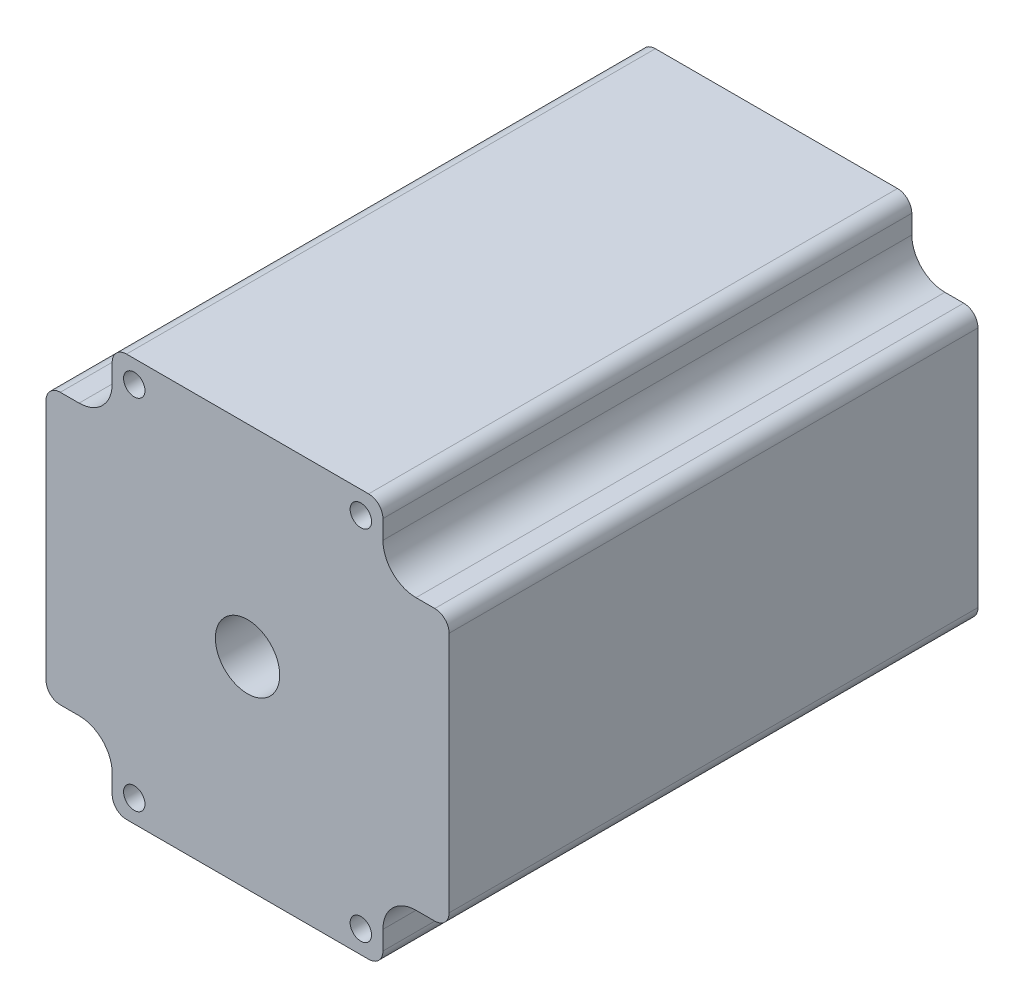
ISO-10303-21;
HEADER;
FILE_DESCRIPTION(('STEP AP214'),'2;1');
FILE_NAME('part.step','',(''),(''),'','','');
FILE_SCHEMA(('AUTOMOTIVE_DESIGN { 1 0 10303 214 1 1 1 1 }'));
ENDSEC;
DATA;
#1=APPLICATION_CONTEXT('core data for automotive mechanical design processes');
#2=APPLICATION_PROTOCOL_DEFINITION('international standard','automotive_design',2000,#1);
#3=PRODUCT_CONTEXT('',#1,'mechanical');
#4=PRODUCT('Part','Part','',(#3));
#5=PRODUCT_RELATED_PRODUCT_CATEGORY('part','',(#4));
#6=PRODUCT_DEFINITION_FORMATION('','',#4);
#7=PRODUCT_DEFINITION_CONTEXT('part definition',#1,'design');
#8=PRODUCT_DEFINITION('design','',#6,#7);
#9=PRODUCT_DEFINITION_SHAPE('','',#8);
#10=(LENGTH_UNIT() NAMED_UNIT(*) SI_UNIT(.MILLI.,.METRE.));
#11=(NAMED_UNIT(*) PLANE_ANGLE_UNIT() SI_UNIT($,.RADIAN.));
#12=(NAMED_UNIT(*) SI_UNIT($,.STERADIAN.) SOLID_ANGLE_UNIT());
#13=UNCERTAINTY_MEASURE_WITH_UNIT(LENGTH_MEASURE(1.E-05),#10,'distance_accuracy_value','');
#14=(GEOMETRIC_REPRESENTATION_CONTEXT(3) GLOBAL_UNCERTAINTY_ASSIGNED_CONTEXT((#13)) GLOBAL_UNIT_ASSIGNED_CONTEXT((#10,
#11,#12)) REPRESENTATION_CONTEXT('',''));
#15=CARTESIAN_POINT('',(0.,0.,0.));
#16=DIRECTION('',(0.,0.,1.));
#17=DIRECTION('',(1.,0.,0.));
#18=AXIS2_PLACEMENT_3D('',#15,#16,#17);
#19=CARTESIAN_POINT('',(26.2,16.94,-85.));
#20=DIRECTION('',(0.,0.,1.));
#21=DIRECTION('',(1.,0.,0.));
#22=AXIS2_PLACEMENT_3D('',#19,#20,#21);
#23=CYLINDRICAL_SURFACE('',#22,2.);
#24=CARTESIAN_POINT('',(26.2,16.94,-11.));
#25=DIRECTION('',(0.,0.,-1.));
#26=DIRECTION('',(-1.,0.,0.));
#27=AXIS2_PLACEMENT_3D('',#24,#25,#26);
#28=CIRCLE('',#27,2.);
#29=CARTESIAN_POINT('',(26.2,18.94,-11.));
#30=VERTEX_POINT('',#29);
#31=CARTESIAN_POINT('',(28.2,16.94,-11.));
#32=VERTEX_POINT('',#31);
#33=EDGE_CURVE('E231',#30,#32,#28,.T.);
#34=ORIENTED_EDGE('',*,*,#33,.T.);
#35=DIRECTION('',(0.,0.,1.));
#36=VECTOR('',#35,1.);
#37=CARTESIAN_POINT('',(28.2,16.94,-85.));
#38=LINE('',#37,#36);
#39=CARTESIAN_POINT('',(28.2,16.94,-85.));
#40=VERTEX_POINT('',#39);
#41=EDGE_CURVE('E11',#40,#32,#38,.T.);
#42=ORIENTED_EDGE('',*,*,#41,.F.);
#43=CARTESIAN_POINT('',(26.2,16.94,-85.));
#44=DIRECTION('',(0.,0.,-1.));
#45=DIRECTION('',(-1.,0.,0.));
#46=AXIS2_PLACEMENT_3D('',#43,#44,#45);
#47=CIRCLE('',#46,2.);
#48=CARTESIAN_POINT('',(26.2,18.94,-85.));
#49=VERTEX_POINT('',#48);
#50=EDGE_CURVE('E278',#49,#40,#47,.T.);
#51=ORIENTED_EDGE('',*,*,#50,.F.);
#52=DIRECTION('',(0.,0.,1.));
#53=VECTOR('',#52,1.);
#54=CARTESIAN_POINT('',(26.2,18.94,-85.));
#55=LINE('',#54,#53);
#56=EDGE_CURVE('E227',#49,#30,#55,.T.);
#57=ORIENTED_EDGE('',*,*,#56,.T.);
#58=EDGE_LOOP('',(#34,#42,#51,#57));
#59=FACE_BOUND('',#58,.T.);
#60=ADVANCED_FACE('F38',(#59),#23,.T.);
#61=CARTESIAN_POINT('',(28.2,16.94,-85.));
#62=DIRECTION('',(-1.,0.,0.));
#63=DIRECTION('',(0.,0.,1.));
#64=AXIS2_PLACEMENT_3D('',#61,#62,#63);
#65=PLANE('',#64);
#66=DIRECTION('',(0.,-1.,0.));
#67=VECTOR('',#66,1.);
#68=CARTESIAN_POINT('',(28.2,16.94,-11.));
#69=LINE('',#68,#67);
#70=CARTESIAN_POINT('',(28.2,-16.94,-11.));
#71=VERTEX_POINT('',#70);
#72=EDGE_CURVE('E234',#32,#71,#69,.T.);
#73=ORIENTED_EDGE('',*,*,#72,.T.);
#74=DIRECTION('',(0.,0.,1.));
#75=VECTOR('',#74,1.);
#76=CARTESIAN_POINT('',(28.2,-16.94,-85.));
#77=LINE('',#76,#75);
#78=CARTESIAN_POINT('',(28.2,-16.94,-85.));
#79=VERTEX_POINT('',#78);
#80=EDGE_CURVE('E47',#79,#71,#77,.T.);
#81=ORIENTED_EDGE('',*,*,#80,.F.);
#82=DIRECTION('',(0.,-1.,0.));
#83=VECTOR('',#82,1.);
#84=CARTESIAN_POINT('',(28.2,16.94,-85.));
#85=LINE('',#84,#83);
#86=EDGE_CURVE('E146',#40,#79,#85,.T.);
#87=ORIENTED_EDGE('',*,*,#86,.F.);
#88=ORIENTED_EDGE('',*,*,#41,.T.);
#89=EDGE_LOOP('',(#73,#81,#87,#88));
#90=FACE_BOUND('',#89,.T.);
#91=ADVANCED_FACE('F418',(#90),#65,.F.);
#92=CARTESIAN_POINT('',(26.2,-16.94,-85.));
#93=DIRECTION('',(0.,0.,1.));
#94=DIRECTION('',(1.,0.,0.));
#95=AXIS2_PLACEMENT_3D('',#92,#93,#94);
#96=CYLINDRICAL_SURFACE('',#95,2.);
#97=CARTESIAN_POINT('',(26.2,-16.94,-11.));
#98=DIRECTION('',(0.,0.,-1.));
#99=DIRECTION('',(-1.,0.,0.));
#100=AXIS2_PLACEMENT_3D('',#97,#98,#99);
#101=CIRCLE('',#100,2.);
#102=CARTESIAN_POINT('',(26.2,-18.94,-11.));
#103=VERTEX_POINT('',#102);
#104=EDGE_CURVE('E237',#71,#103,#101,.T.);
#105=ORIENTED_EDGE('',*,*,#104,.T.);
#106=DIRECTION('',(0.,0.,1.));
#107=VECTOR('',#106,1.);
#108=CARTESIAN_POINT('',(26.2,-18.94,-85.));
#109=LINE('',#108,#107);
#110=CARTESIAN_POINT('',(26.2,-18.94,-85.));
#111=VERTEX_POINT('',#110);
#112=EDGE_CURVE('E333',#111,#103,#109,.T.);
#113=ORIENTED_EDGE('',*,*,#112,.F.);
#114=CARTESIAN_POINT('',(26.2,-16.94,-85.));
#115=DIRECTION('',(0.,0.,-1.));
#116=DIRECTION('',(-1.,0.,0.));
#117=AXIS2_PLACEMENT_3D('',#114,#115,#116);
#118=CIRCLE('',#117,2.);
#119=EDGE_CURVE('E342',#79,#111,#118,.T.);
#120=ORIENTED_EDGE('',*,*,#119,.F.);
#121=ORIENTED_EDGE('',*,*,#80,.T.);
#122=EDGE_LOOP('',(#105,#113,#120,#121));
#123=FACE_BOUND('',#122,.T.);
#124=ADVANCED_FACE('F340',(#123),#96,.T.);
#125=CARTESIAN_POINT('',(26.2,-18.94,-85.));
#126=DIRECTION('',(0.,1.,0.));
#127=DIRECTION('',(0.,0.,1.));
#128=AXIS2_PLACEMENT_3D('',#125,#126,#127);
#129=PLANE('',#128);
#130=DIRECTION('',(-1.,0.,0.));
#131=VECTOR('',#130,1.);
#132=CARTESIAN_POINT('',(26.2,-18.94,-11.));
#133=LINE('',#132,#131);
#134=CARTESIAN_POINT('',(23.57,-18.94,-11.));
#135=VERTEX_POINT('',#134);
#136=EDGE_CURVE('E239',#103,#135,#133,.T.);
#137=ORIENTED_EDGE('',*,*,#136,.T.);
#138=DIRECTION('',(0.,0.,1.));
#139=VECTOR('',#138,1.);
#140=CARTESIAN_POINT('',(23.57,-18.94,-85.));
#141=LINE('',#140,#139);
#142=CARTESIAN_POINT('',(23.57,-18.94,-85.));
#143=VERTEX_POINT('',#142);
#144=EDGE_CURVE('E330',#143,#135,#141,.T.);
#145=ORIENTED_EDGE('',*,*,#144,.F.);
#146=DIRECTION('',(-1.,0.,0.));
#147=VECTOR('',#146,1.);
#148=CARTESIAN_POINT('',(26.2,-18.94,-85.));
#149=LINE('',#148,#147);
#150=EDGE_CURVE('E360',#111,#143,#149,.T.);
#151=ORIENTED_EDGE('',*,*,#150,.F.);
#152=ORIENTED_EDGE('',*,*,#112,.T.);
#153=EDGE_LOOP('',(#137,#145,#151,#152));
#154=FACE_BOUND('',#153,.T.);
#155=ADVANCED_FACE('F351',(#154),#129,.F.);
#156=CARTESIAN_POINT('',(23.57,-23.57,-85.));
#157=DIRECTION('',(0.,0.,1.));
#158=DIRECTION('',(1.,0.,0.));
#159=AXIS2_PLACEMENT_3D('',#156,#157,#158);
#160=CYLINDRICAL_SURFACE('',#159,4.63);
#161=CARTESIAN_POINT('',(23.57,-23.57,-11.));
#162=DIRECTION('',(0.,0.,1.));
#163=DIRECTION('',(-1.,0.,0.));
#164=AXIS2_PLACEMENT_3D('',#161,#162,#163);
#165=CIRCLE('',#164,4.63);
#166=CARTESIAN_POINT('',(18.94,-23.57,-11.));
#167=VERTEX_POINT('',#166);
#168=EDGE_CURVE('E241',#135,#167,#165,.T.);
#169=ORIENTED_EDGE('',*,*,#168,.T.);
#170=DIRECTION('',(0.,0.,1.));
#171=VECTOR('',#170,1.);
#172=CARTESIAN_POINT('',(18.94,-23.57,-85.));
#173=LINE('',#172,#171);
#174=CARTESIAN_POINT('',(18.94,-23.57,-85.));
#175=VERTEX_POINT('',#174);
#176=EDGE_CURVE('E327',#175,#167,#173,.T.);
#177=ORIENTED_EDGE('',*,*,#176,.F.);
#178=CARTESIAN_POINT('',(23.57,-23.57,-85.));
#179=DIRECTION('',(0.,0.,1.));
#180=DIRECTION('',(-1.,0.,0.));
#181=AXIS2_PLACEMENT_3D('',#178,#179,#180);
#182=CIRCLE('',#181,4.63);
#183=EDGE_CURVE('E357',#143,#175,#182,.T.);
#184=ORIENTED_EDGE('',*,*,#183,.F.);
#185=ORIENTED_EDGE('',*,*,#144,.T.);
#186=EDGE_LOOP('',(#169,#177,#184,#185));
#187=FACE_BOUND('',#186,.T.);
#188=ADVANCED_FACE('F355',(#187),#160,.F.);
#189=CARTESIAN_POINT('',(18.94,-23.57,-85.));
#190=DIRECTION('',(-1.,0.,0.));
#191=DIRECTION('',(0.,0.,1.));
#192=AXIS2_PLACEMENT_3D('',#189,#190,#191);
#193=PLANE('',#192);
#194=DIRECTION('',(0.,-1.,0.));
#195=VECTOR('',#194,1.);
#196=CARTESIAN_POINT('',(18.94,-23.57,-11.));
#197=LINE('',#196,#195);
#198=CARTESIAN_POINT('',(18.94,-26.2,-11.));
#199=VERTEX_POINT('',#198);
#200=EDGE_CURVE('E243',#167,#199,#197,.T.);
#201=ORIENTED_EDGE('',*,*,#200,.T.);
#202=DIRECTION('',(0.,0.,1.));
#203=VECTOR('',#202,1.);
#204=CARTESIAN_POINT('',(18.94,-26.2,-85.));
#205=LINE('',#204,#203);
#206=CARTESIAN_POINT('',(18.94,-26.2,-85.));
#207=VERTEX_POINT('',#206);
#208=EDGE_CURVE('E324',#207,#199,#205,.T.);
#209=ORIENTED_EDGE('',*,*,#208,.F.);
#210=DIRECTION('',(0.,-1.,0.));
#211=VECTOR('',#210,1.);
#212=CARTESIAN_POINT('',(18.94,-23.57,-85.));
#213=LINE('',#212,#211);
#214=EDGE_CURVE('E359',#175,#207,#213,.T.);
#215=ORIENTED_EDGE('',*,*,#214,.F.);
#216=ORIENTED_EDGE('',*,*,#176,.T.);
#217=EDGE_LOOP('',(#201,#209,#215,#216));
#218=FACE_BOUND('',#217,.T.);
#219=ADVANCED_FACE('F431',(#218),#193,.F.);
#220=CARTESIAN_POINT('',(16.94,-26.2,-85.));
#221=DIRECTION('',(0.,0.,1.));
#222=DIRECTION('',(1.,0.,0.));
#223=AXIS2_PLACEMENT_3D('',#220,#221,#222);
#224=CYLINDRICAL_SURFACE('',#223,2.);
#225=CARTESIAN_POINT('',(16.94,-26.2,-11.));
#226=DIRECTION('',(0.,0.,-1.));
#227=DIRECTION('',(-1.,0.,0.));
#228=AXIS2_PLACEMENT_3D('',#225,#226,#227);
#229=CIRCLE('',#228,2.);
#230=CARTESIAN_POINT('',(16.94,-28.2,-11.));
#231=VERTEX_POINT('',#230);
#232=EDGE_CURVE('E245',#199,#231,#229,.T.);
#233=ORIENTED_EDGE('',*,*,#232,.T.);
#234=DIRECTION('',(0.,0.,1.));
#235=VECTOR('',#234,1.);
#236=CARTESIAN_POINT('',(16.94,-28.2,-85.));
#237=LINE('',#236,#235);
#238=CARTESIAN_POINT('',(16.94,-28.2,-85.));
#239=VERTEX_POINT('',#238);
#240=EDGE_CURVE('E321',#239,#231,#237,.T.);
#241=ORIENTED_EDGE('',*,*,#240,.F.);
#242=CARTESIAN_POINT('',(16.94,-26.2,-85.));
#243=DIRECTION('',(0.,0.,-1.));
#244=DIRECTION('',(-1.,0.,0.));
#245=AXIS2_PLACEMENT_3D('',#242,#243,#244);
#246=CIRCLE('',#245,2.);
#247=EDGE_CURVE('E362',#207,#239,#246,.T.);
#248=ORIENTED_EDGE('',*,*,#247,.F.);
#249=ORIENTED_EDGE('',*,*,#208,.T.);
#250=EDGE_LOOP('',(#233,#241,#248,#249));
#251=FACE_BOUND('',#250,.T.);
#252=ADVANCED_FACE('F434',(#251),#224,.T.);
#253=CARTESIAN_POINT('',(16.94,-28.2,-85.));
#254=DIRECTION('',(0.,1.,0.));
#255=DIRECTION('',(0.,0.,1.));
#256=AXIS2_PLACEMENT_3D('',#253,#254,#255);
#257=PLANE('',#256);
#258=DIRECTION('',(-1.,0.,0.));
#259=VECTOR('',#258,1.);
#260=CARTESIAN_POINT('',(16.94,-28.2,-11.));
#261=LINE('',#260,#259);
#262=CARTESIAN_POINT('',(-16.94,-28.2,-11.));
#263=VERTEX_POINT('',#262);
#264=EDGE_CURVE('E247',#231,#263,#261,.T.);
#265=ORIENTED_EDGE('',*,*,#264,.T.);
#266=DIRECTION('',(0.,0.,1.));
#267=VECTOR('',#266,1.);
#268=CARTESIAN_POINT('',(-16.94,-28.2,-85.));
#269=LINE('',#268,#267);
#270=CARTESIAN_POINT('',(-16.94,-28.2,-85.));
#271=VERTEX_POINT('',#270);
#272=EDGE_CURVE('E318',#271,#263,#269,.T.);
#273=ORIENTED_EDGE('',*,*,#272,.F.);
#274=DIRECTION('',(-1.,0.,0.));
#275=VECTOR('',#274,1.);
#276=CARTESIAN_POINT('',(16.94,-28.2,-85.));
#277=LINE('',#276,#275);
#278=EDGE_CURVE('E368',#239,#271,#277,.T.);
#279=ORIENTED_EDGE('',*,*,#278,.F.);
#280=ORIENTED_EDGE('',*,*,#240,.T.);
#281=EDGE_LOOP('',(#265,#273,#279,#280));
#282=FACE_BOUND('',#281,.T.);
#283=ADVANCED_FACE('F438',(#282),#257,.F.);
#284=CARTESIAN_POINT('',(-16.94,-26.2,-85.));
#285=DIRECTION('',(0.,0.,1.));
#286=DIRECTION('',(1.,0.,0.));
#287=AXIS2_PLACEMENT_3D('',#284,#285,#286);
#288=CYLINDRICAL_SURFACE('',#287,2.);
#289=CARTESIAN_POINT('',(-16.94,-26.2,-11.));
#290=DIRECTION('',(0.,0.,-1.));
#291=DIRECTION('',(-1.,0.,0.));
#292=AXIS2_PLACEMENT_3D('',#289,#290,#291);
#293=CIRCLE('',#292,2.);
#294=CARTESIAN_POINT('',(-18.94,-26.2,-11.));
#295=VERTEX_POINT('',#294);
#296=EDGE_CURVE('E249',#263,#295,#293,.T.);
#297=ORIENTED_EDGE('',*,*,#296,.T.);
#298=DIRECTION('',(0.,0.,1.));
#299=VECTOR('',#298,1.);
#300=CARTESIAN_POINT('',(-18.94,-26.2,-85.));
#301=LINE('',#300,#299);
#302=CARTESIAN_POINT('',(-18.94,-26.2,-85.));
#303=VERTEX_POINT('',#302);
#304=EDGE_CURVE('E315',#303,#295,#301,.T.);
#305=ORIENTED_EDGE('',*,*,#304,.F.);
#306=CARTESIAN_POINT('',(-16.94,-26.2,-85.));
#307=DIRECTION('',(0.,0.,-1.));
#308=DIRECTION('',(-1.,0.,0.));
#309=AXIS2_PLACEMENT_3D('',#306,#307,#308);
#310=CIRCLE('',#309,2.);
#311=EDGE_CURVE('E370',#271,#303,#310,.T.);
#312=ORIENTED_EDGE('',*,*,#311,.F.);
#313=ORIENTED_EDGE('',*,*,#272,.T.);
#314=EDGE_LOOP('',(#297,#305,#312,#313));
#315=FACE_BOUND('',#314,.T.);
#316=ADVANCED_FACE('F442',(#315),#288,.T.);
#317=CARTESIAN_POINT('',(-18.94,-26.2,-85.));
#318=DIRECTION('',(1.,0.,0.));
#319=DIRECTION('',(0.,0.,-1.));
#320=AXIS2_PLACEMENT_3D('',#317,#318,#319);
#321=PLANE('',#320);
#322=DIRECTION('',(0.,1.,0.));
#323=VECTOR('',#322,1.);
#324=CARTESIAN_POINT('',(-18.94,-26.2,-11.));
#325=LINE('',#324,#323);
#326=CARTESIAN_POINT('',(-18.94,-23.57,-11.));
#327=VERTEX_POINT('',#326);
#328=EDGE_CURVE('E251',#295,#327,#325,.T.);
#329=ORIENTED_EDGE('',*,*,#328,.T.);
#330=DIRECTION('',(0.,0.,1.));
#331=VECTOR('',#330,1.);
#332=CARTESIAN_POINT('',(-18.94,-23.57,-85.));
#333=LINE('',#332,#331);
#334=CARTESIAN_POINT('',(-18.94,-23.57,-85.));
#335=VERTEX_POINT('',#334);
#336=EDGE_CURVE('E312',#335,#327,#333,.T.);
#337=ORIENTED_EDGE('',*,*,#336,.F.);
#338=DIRECTION('',(0.,1.,0.));
#339=VECTOR('',#338,1.);
#340=CARTESIAN_POINT('',(-18.94,-26.2,-85.));
#341=LINE('',#340,#339);
#342=EDGE_CURVE('E372',#303,#335,#341,.T.);
#343=ORIENTED_EDGE('',*,*,#342,.F.);
#344=ORIENTED_EDGE('',*,*,#304,.T.);
#345=EDGE_LOOP('',(#329,#337,#343,#344));
#346=FACE_BOUND('',#345,.T.);
#347=ADVANCED_FACE('F446',(#346),#321,.F.);
#348=CARTESIAN_POINT('',(-23.57,-23.57,-85.));
#349=DIRECTION('',(0.,0.,1.));
#350=DIRECTION('',(1.,0.,0.));
#351=AXIS2_PLACEMENT_3D('',#348,#349,#350);
#352=CYLINDRICAL_SURFACE('',#351,4.63);
#353=CARTESIAN_POINT('',(-23.57,-23.57,-11.));
#354=DIRECTION('',(0.,0.,1.));
#355=DIRECTION('',(-1.,0.,0.));
#356=AXIS2_PLACEMENT_3D('',#353,#354,#355);
#357=CIRCLE('',#356,4.63);
#358=CARTESIAN_POINT('',(-23.57,-18.94,-11.));
#359=VERTEX_POINT('',#358);
#360=EDGE_CURVE('E253',#327,#359,#357,.T.);
#361=ORIENTED_EDGE('',*,*,#360,.T.);
#362=DIRECTION('',(0.,0.,1.));
#363=VECTOR('',#362,1.);
#364=CARTESIAN_POINT('',(-23.57,-18.94,-85.));
#365=LINE('',#364,#363);
#366=CARTESIAN_POINT('',(-23.57,-18.94,-85.));
#367=VERTEX_POINT('',#366);
#368=EDGE_CURVE('E309',#367,#359,#365,.T.);
#369=ORIENTED_EDGE('',*,*,#368,.F.);
#370=CARTESIAN_POINT('',(-23.57,-23.57,-85.));
#371=DIRECTION('',(0.,0.,1.));
#372=DIRECTION('',(-1.,0.,0.));
#373=AXIS2_PLACEMENT_3D('',#370,#371,#372);
#374=CIRCLE('',#373,4.63);
#375=EDGE_CURVE('E374',#335,#367,#374,.T.);
#376=ORIENTED_EDGE('',*,*,#375,.F.);
#377=ORIENTED_EDGE('',*,*,#336,.T.);
#378=EDGE_LOOP('',(#361,#369,#376,#377));
#379=FACE_BOUND('',#378,.T.);
#380=ADVANCED_FACE('F450',(#379),#352,.F.);
#381=CARTESIAN_POINT('',(-23.57,-18.94,-85.));
#382=DIRECTION('',(0.,1.,0.));
#383=DIRECTION('',(-1.,0.,0.));
#384=AXIS2_PLACEMENT_3D('',#381,#382,#383);
#385=PLANE('',#384);
#386=DIRECTION('',(-1.,0.,0.));
#387=VECTOR('',#386,1.);
#388=CARTESIAN_POINT('',(-23.57,-18.94,-11.));
#389=LINE('',#388,#387);
#390=CARTESIAN_POINT('',(-26.2,-18.94,-11.));
#391=VERTEX_POINT('',#390);
#392=EDGE_CURVE('E255',#359,#391,#389,.T.);
#393=ORIENTED_EDGE('',*,*,#392,.T.);
#394=DIRECTION('',(0.,0.,1.));
#395=VECTOR('',#394,1.);
#396=CARTESIAN_POINT('',(-26.2,-18.94,-85.));
#397=LINE('',#396,#395);
#398=CARTESIAN_POINT('',(-26.2,-18.94,-85.));
#399=VERTEX_POINT('',#398);
#400=EDGE_CURVE('E306',#399,#391,#397,.T.);
#401=ORIENTED_EDGE('',*,*,#400,.F.);
#402=DIRECTION('',(-1.,0.,0.));
#403=VECTOR('',#402,1.);
#404=CARTESIAN_POINT('',(-23.57,-18.94,-85.));
#405=LINE('',#404,#403);
#406=EDGE_CURVE('E376',#367,#399,#405,.T.);
#407=ORIENTED_EDGE('',*,*,#406,.F.);
#408=ORIENTED_EDGE('',*,*,#368,.T.);
#409=EDGE_LOOP('',(#393,#401,#407,#408));
#410=FACE_BOUND('',#409,.T.);
#411=ADVANCED_FACE('F454',(#410),#385,.F.);
#412=CARTESIAN_POINT('',(-26.2,-16.94,-85.));
#413=DIRECTION('',(0.,0.,1.));
#414=DIRECTION('',(1.,0.,0.));
#415=AXIS2_PLACEMENT_3D('',#412,#413,#414);
#416=CYLINDRICAL_SURFACE('',#415,2.);
#417=CARTESIAN_POINT('',(-26.2,-16.94,-11.));
#418=DIRECTION('',(0.,0.,-1.));
#419=DIRECTION('',(-1.,0.,0.));
#420=AXIS2_PLACEMENT_3D('',#417,#418,#419);
#421=CIRCLE('',#420,2.);
#422=CARTESIAN_POINT('',(-28.2,-16.94,-11.));
#423=VERTEX_POINT('',#422);
#424=EDGE_CURVE('E257',#391,#423,#421,.T.);
#425=ORIENTED_EDGE('',*,*,#424,.T.);
#426=DIRECTION('',(0.,0.,1.));
#427=VECTOR('',#426,1.);
#428=CARTESIAN_POINT('',(-28.2,-16.94,-85.));
#429=LINE('',#428,#427);
#430=CARTESIAN_POINT('',(-28.2,-16.94,-85.));
#431=VERTEX_POINT('',#430);
#432=EDGE_CURVE('E303',#431,#423,#429,.T.);
#433=ORIENTED_EDGE('',*,*,#432,.F.);
#434=CARTESIAN_POINT('',(-26.2,-16.94,-85.));
#435=DIRECTION('',(0.,0.,-1.));
#436=DIRECTION('',(-1.,0.,0.));
#437=AXIS2_PLACEMENT_3D('',#434,#435,#436);
#438=CIRCLE('',#437,2.);
#439=EDGE_CURVE('E378',#399,#431,#438,.T.);
#440=ORIENTED_EDGE('',*,*,#439,.F.);
#441=ORIENTED_EDGE('',*,*,#400,.T.);
#442=EDGE_LOOP('',(#425,#433,#440,#441));
#443=FACE_BOUND('',#442,.T.);
#444=ADVANCED_FACE('F458',(#443),#416,.T.);
#445=CARTESIAN_POINT('',(-28.2,-16.94,-85.));
#446=DIRECTION('',(1.,0.,0.));
#447=DIRECTION('',(0.,1.,0.));
#448=AXIS2_PLACEMENT_3D('',#445,#446,#447);
#449=PLANE('',#448);
#450=DIRECTION('',(0.,1.,0.));
#451=VECTOR('',#450,1.);
#452=CARTESIAN_POINT('',(-28.2,-16.94,-11.));
#453=LINE('',#452,#451);
#454=CARTESIAN_POINT('',(-28.2,16.94,-11.));
#455=VERTEX_POINT('',#454);
#456=EDGE_CURVE('E259',#423,#455,#453,.T.);
#457=ORIENTED_EDGE('',*,*,#456,.T.);
#458=DIRECTION('',(0.,0.,1.));
#459=VECTOR('',#458,1.);
#460=CARTESIAN_POINT('',(-28.2,16.94,-85.));
#461=LINE('',#460,#459);
#462=CARTESIAN_POINT('',(-28.2,16.94,-85.));
#463=VERTEX_POINT('',#462);
#464=EDGE_CURVE('E300',#463,#455,#461,.T.);
#465=ORIENTED_EDGE('',*,*,#464,.F.);
#466=DIRECTION('',(0.,1.,0.));
#467=VECTOR('',#466,1.);
#468=CARTESIAN_POINT('',(-28.2,-16.94,-85.));
#469=LINE('',#468,#467);
#470=EDGE_CURVE('E380',#431,#463,#469,.T.);
#471=ORIENTED_EDGE('',*,*,#470,.F.);
#472=ORIENTED_EDGE('',*,*,#432,.T.);
#473=EDGE_LOOP('',(#457,#465,#471,#472));
#474=FACE_BOUND('',#473,.T.);
#475=ADVANCED_FACE('F462',(#474),#449,.F.);
#476=CARTESIAN_POINT('',(-26.2,16.94,-85.));
#477=DIRECTION('',(0.,0.,1.));
#478=DIRECTION('',(1.,0.,0.));
#479=AXIS2_PLACEMENT_3D('',#476,#477,#478);
#480=CYLINDRICAL_SURFACE('',#479,2.);
#481=CARTESIAN_POINT('',(-26.2,16.94,-11.));
#482=DIRECTION('',(0.,0.,-1.));
#483=DIRECTION('',(-1.,0.,0.));
#484=AXIS2_PLACEMENT_3D('',#481,#482,#483);
#485=CIRCLE('',#484,2.);
#486=CARTESIAN_POINT('',(-26.2,18.94,-11.));
#487=VERTEX_POINT('',#486);
#488=EDGE_CURVE('E261',#455,#487,#485,.T.);
#489=ORIENTED_EDGE('',*,*,#488,.T.);
#490=DIRECTION('',(0.,0.,1.));
#491=VECTOR('',#490,1.);
#492=CARTESIAN_POINT('',(-26.2,18.94,-85.));
#493=LINE('',#492,#491);
#494=CARTESIAN_POINT('',(-26.2,18.94,-85.));
#495=VERTEX_POINT('',#494);
#496=EDGE_CURVE('E297',#495,#487,#493,.T.);
#497=ORIENTED_EDGE('',*,*,#496,.F.);
#498=CARTESIAN_POINT('',(-26.2,16.94,-85.));
#499=DIRECTION('',(0.,0.,-1.));
#500=DIRECTION('',(-1.,0.,0.));
#501=AXIS2_PLACEMENT_3D('',#498,#499,#500);
#502=CIRCLE('',#501,2.);
#503=EDGE_CURVE('E382',#463,#495,#502,.T.);
#504=ORIENTED_EDGE('',*,*,#503,.F.);
#505=ORIENTED_EDGE('',*,*,#464,.T.);
#506=EDGE_LOOP('',(#489,#497,#504,#505));
#507=FACE_BOUND('',#506,.T.);
#508=ADVANCED_FACE('F466',(#507),#480,.T.);
#509=CARTESIAN_POINT('',(-26.2,18.94,-85.));
#510=DIRECTION('',(0.,-1.,0.));
#511=DIRECTION('',(1.,0.,0.));
#512=AXIS2_PLACEMENT_3D('',#509,#510,#511);
#513=PLANE('',#512);
#514=DIRECTION('',(1.,0.,0.));
#515=VECTOR('',#514,1.);
#516=CARTESIAN_POINT('',(-26.2,18.94,-11.));
#517=LINE('',#516,#515);
#518=CARTESIAN_POINT('',(-23.5699999999999,18.94,-11.));
#519=VERTEX_POINT('',#518);
#520=EDGE_CURVE('E263',#487,#519,#517,.T.);
#521=ORIENTED_EDGE('',*,*,#520,.T.);
#522=DIRECTION('',(0.,0.,1.));
#523=VECTOR('',#522,1.);
#524=CARTESIAN_POINT('',(-23.5699999999999,18.94,-85.));
#525=LINE('',#524,#523);
#526=CARTESIAN_POINT('',(-23.5699999999999,18.94,-85.));
#527=VERTEX_POINT('',#526);
#528=EDGE_CURVE('E294',#527,#519,#525,.T.);
#529=ORIENTED_EDGE('',*,*,#528,.F.);
#530=DIRECTION('',(1.,0.,0.));
#531=VECTOR('',#530,1.);
#532=CARTESIAN_POINT('',(-26.2,18.94,-85.));
#533=LINE('',#532,#531);
#534=EDGE_CURVE('E384',#495,#527,#533,.T.);
#535=ORIENTED_EDGE('',*,*,#534,.F.);
#536=ORIENTED_EDGE('',*,*,#496,.T.);
#537=EDGE_LOOP('',(#521,#529,#535,#536));
#538=FACE_BOUND('',#537,.T.);
#539=ADVANCED_FACE('F470',(#538),#513,.F.);
#540=CARTESIAN_POINT('',(-23.5699999999999,23.57,-85.));
#541=DIRECTION('',(0.,0.,1.));
#542=DIRECTION('',(1.,0.,0.));
#543=AXIS2_PLACEMENT_3D('',#540,#541,#542);
#544=CYLINDRICAL_SURFACE('',#543,4.63);
#545=CARTESIAN_POINT('',(-23.5699999999999,23.57,-11.));
#546=DIRECTION('',(0.,0.,1.));
#547=DIRECTION('',(-1.,0.,0.));
#548=AXIS2_PLACEMENT_3D('',#545,#546,#547);
#549=CIRCLE('',#548,4.63);
#550=CARTESIAN_POINT('',(-18.9399999999999,23.57,-11.));
#551=VERTEX_POINT('',#550);
#552=EDGE_CURVE('E265',#519,#551,#549,.T.);
#553=ORIENTED_EDGE('',*,*,#552,.T.);
#554=DIRECTION('',(0.,0.,1.));
#555=VECTOR('',#554,1.);
#556=CARTESIAN_POINT('',(-18.9399999999999,23.57,-85.));
#557=LINE('',#556,#555);
#558=CARTESIAN_POINT('',(-18.9399999999999,23.57,-85.));
#559=VERTEX_POINT('',#558);
#560=EDGE_CURVE('E291',#559,#551,#557,.T.);
#561=ORIENTED_EDGE('',*,*,#560,.F.);
#562=CARTESIAN_POINT('',(-23.5699999999999,23.57,-85.));
#563=DIRECTION('',(0.,0.,1.));
#564=DIRECTION('',(-1.,0.,0.));
#565=AXIS2_PLACEMENT_3D('',#562,#563,#564);
#566=CIRCLE('',#565,4.63);
#567=EDGE_CURVE('E386',#527,#559,#566,.T.);
#568=ORIENTED_EDGE('',*,*,#567,.F.);
#569=ORIENTED_EDGE('',*,*,#528,.T.);
#570=EDGE_LOOP('',(#553,#561,#568,#569));
#571=FACE_BOUND('',#570,.T.);
#572=ADVANCED_FACE('F474',(#571),#544,.F.);
#573=CARTESIAN_POINT('',(-18.9399999999999,23.57,-85.));
#574=DIRECTION('',(1.,0.,0.));
#575=DIRECTION('',(0.,0.,-1.));
#576=AXIS2_PLACEMENT_3D('',#573,#574,#575);
#577=PLANE('',#576);
#578=DIRECTION('',(0.,1.,0.));
#579=VECTOR('',#578,1.);
#580=CARTESIAN_POINT('',(-18.9399999999999,23.57,-11.));
#581=LINE('',#580,#579);
#582=CARTESIAN_POINT('',(-18.9399999999999,26.2,-11.));
#583=VERTEX_POINT('',#582);
#584=EDGE_CURVE('E267',#551,#583,#581,.T.);
#585=ORIENTED_EDGE('',*,*,#584,.T.);
#586=DIRECTION('',(0.,0.,1.));
#587=VECTOR('',#586,1.);
#588=CARTESIAN_POINT('',(-18.9399999999999,26.2,-85.));
#589=LINE('',#588,#587);
#590=CARTESIAN_POINT('',(-18.9399999999999,26.2,-85.));
#591=VERTEX_POINT('',#590);
#592=EDGE_CURVE('E288',#591,#583,#589,.T.);
#593=ORIENTED_EDGE('',*,*,#592,.F.);
#594=DIRECTION('',(0.,1.,0.));
#595=VECTOR('',#594,1.);
#596=CARTESIAN_POINT('',(-18.9399999999999,23.57,-85.));
#597=LINE('',#596,#595);
#598=EDGE_CURVE('E388',#559,#591,#597,.T.);
#599=ORIENTED_EDGE('',*,*,#598,.F.);
#600=ORIENTED_EDGE('',*,*,#560,.T.);
#601=EDGE_LOOP('',(#585,#593,#599,#600));
#602=FACE_BOUND('',#601,.T.);
#603=ADVANCED_FACE('F478',(#602),#577,.F.);
#604=CARTESIAN_POINT('',(-16.9399999999999,26.2,-85.));
#605=DIRECTION('',(0.,0.,1.));
#606=DIRECTION('',(1.,0.,0.));
#607=AXIS2_PLACEMENT_3D('',#604,#605,#606);
#608=CYLINDRICAL_SURFACE('',#607,2.);
#609=CARTESIAN_POINT('',(-16.9399999999999,26.2,-11.));
#610=DIRECTION('',(0.,0.,-1.));
#611=DIRECTION('',(-1.,0.,0.));
#612=AXIS2_PLACEMENT_3D('',#609,#610,#611);
#613=CIRCLE('',#612,2.);
#614=CARTESIAN_POINT('',(-16.9399999999999,28.2,-11.));
#615=VERTEX_POINT('',#614);
#616=EDGE_CURVE('E269',#583,#615,#613,.T.);
#617=ORIENTED_EDGE('',*,*,#616,.T.);
#618=DIRECTION('',(0.,0.,1.));
#619=VECTOR('',#618,1.);
#620=CARTESIAN_POINT('',(-16.9399999999999,28.2,-85.));
#621=LINE('',#620,#619);
#622=CARTESIAN_POINT('',(-16.9399999999999,28.2,-85.));
#623=VERTEX_POINT('',#622);
#624=EDGE_CURVE('E285',#623,#615,#621,.T.);
#625=ORIENTED_EDGE('',*,*,#624,.F.);
#626=CARTESIAN_POINT('',(-16.9399999999999,26.2,-85.));
#627=DIRECTION('',(0.,0.,-1.));
#628=DIRECTION('',(-1.,0.,0.));
#629=AXIS2_PLACEMENT_3D('',#626,#627,#628);
#630=CIRCLE('',#629,2.);
#631=EDGE_CURVE('E390',#591,#623,#630,.T.);
#632=ORIENTED_EDGE('',*,*,#631,.F.);
#633=ORIENTED_EDGE('',*,*,#592,.T.);
#634=EDGE_LOOP('',(#617,#625,#632,#633));
#635=FACE_BOUND('',#634,.T.);
#636=ADVANCED_FACE('F482',(#635),#608,.T.);
#637=CARTESIAN_POINT('',(-16.9399999999999,28.2,-85.));
#638=DIRECTION('',(0.,-1.,0.));
#639=DIRECTION('',(0.,0.,-1.));
#640=AXIS2_PLACEMENT_3D('',#637,#638,#639);
#641=PLANE('',#640);
#642=DIRECTION('',(1.,0.,0.));
#643=VECTOR('',#642,1.);
#644=CARTESIAN_POINT('',(-16.9399999999999,28.2,-11.));
#645=LINE('',#644,#643);
#646=CARTESIAN_POINT('',(16.94,28.2,-11.));
#647=VERTEX_POINT('',#646);
#648=EDGE_CURVE('E271',#615,#647,#645,.T.);
#649=ORIENTED_EDGE('',*,*,#648,.T.);
#650=DIRECTION('',(0.,0.,1.));
#651=VECTOR('',#650,1.);
#652=CARTESIAN_POINT('',(16.94,28.2,-85.));
#653=LINE('',#652,#651);
#654=CARTESIAN_POINT('',(16.94,28.2,-85.));
#655=VERTEX_POINT('',#654);
#656=EDGE_CURVE('E282',#655,#647,#653,.T.);
#657=ORIENTED_EDGE('',*,*,#656,.F.);
#658=DIRECTION('',(1.,0.,0.));
#659=VECTOR('',#658,1.);
#660=CARTESIAN_POINT('',(-16.9399999999999,28.2,-85.));
#661=LINE('',#660,#659);
#662=EDGE_CURVE('E392',#623,#655,#661,.T.);
#663=ORIENTED_EDGE('',*,*,#662,.F.);
#664=ORIENTED_EDGE('',*,*,#624,.T.);
#665=EDGE_LOOP('',(#649,#657,#663,#664));
#666=FACE_BOUND('',#665,.T.);
#667=ADVANCED_FACE('F398',(#666),#641,.F.);
#668=CARTESIAN_POINT('',(16.94,26.2,-85.));
#669=DIRECTION('',(0.,0.,1.));
#670=DIRECTION('',(1.,0.,0.));
#671=AXIS2_PLACEMENT_3D('',#668,#669,#670);
#672=CYLINDRICAL_SURFACE('',#671,2.);
#673=CARTESIAN_POINT('',(16.94,26.2,-11.));
#674=DIRECTION('',(0.,0.,-1.));
#675=DIRECTION('',(-1.,0.,0.));
#676=AXIS2_PLACEMENT_3D('',#673,#674,#675);
#677=CIRCLE('',#676,2.);
#678=CARTESIAN_POINT('',(18.94,26.2,-11.));
#679=VERTEX_POINT('',#678);
#680=EDGE_CURVE('E273',#647,#679,#677,.T.);
#681=ORIENTED_EDGE('',*,*,#680,.T.);
#682=DIRECTION('',(0.,0.,1.));
#683=VECTOR('',#682,1.);
#684=CARTESIAN_POINT('',(18.94,26.2,-85.));
#685=LINE('',#684,#683);
#686=CARTESIAN_POINT('',(18.94,26.2,-85.));
#687=VERTEX_POINT('',#686);
#688=EDGE_CURVE('E222',#687,#679,#685,.T.);
#689=ORIENTED_EDGE('',*,*,#688,.F.);
#690=CARTESIAN_POINT('',(16.94,26.2,-85.));
#691=DIRECTION('',(0.,0.,-1.));
#692=DIRECTION('',(-1.,0.,0.));
#693=AXIS2_PLACEMENT_3D('',#690,#691,#692);
#694=CIRCLE('',#693,2.);
#695=EDGE_CURVE('E213',#655,#687,#694,.T.);
#696=ORIENTED_EDGE('',*,*,#695,.F.);
#697=ORIENTED_EDGE('',*,*,#656,.T.);
#698=EDGE_LOOP('',(#681,#689,#696,#697));
#699=FACE_BOUND('',#698,.T.);
#700=ADVANCED_FACE('F402',(#699),#672,.T.);
#701=CARTESIAN_POINT('',(18.94,26.2,-85.));
#702=DIRECTION('',(-1.,0.,0.));
#703=DIRECTION('',(0.,-1.,0.));
#704=AXIS2_PLACEMENT_3D('',#701,#702,#703);
#705=PLANE('',#704);
#706=DIRECTION('',(0.,-1.,0.));
#707=VECTOR('',#706,1.);
#708=CARTESIAN_POINT('',(18.94,26.2,-11.));
#709=LINE('',#708,#707);
#710=CARTESIAN_POINT('',(18.94,23.57,-11.));
#711=VERTEX_POINT('',#710);
#712=EDGE_CURVE('E221',#679,#711,#709,.T.);
#713=ORIENTED_EDGE('',*,*,#712,.T.);
#714=DIRECTION('',(0.,0.,1.));
#715=VECTOR('',#714,1.);
#716=CARTESIAN_POINT('',(18.94,23.57,-85.));
#717=LINE('',#716,#715);
#718=CARTESIAN_POINT('',(18.94,23.57,-85.));
#719=VERTEX_POINT('',#718);
#720=EDGE_CURVE('E218',#719,#711,#717,.T.);
#721=ORIENTED_EDGE('',*,*,#720,.F.);
#722=DIRECTION('',(0.,-1.,0.));
#723=VECTOR('',#722,1.);
#724=CARTESIAN_POINT('',(18.94,26.2,-85.));
#725=LINE('',#724,#723);
#726=EDGE_CURVE('E207',#687,#719,#725,.T.);
#727=ORIENTED_EDGE('',*,*,#726,.F.);
#728=ORIENTED_EDGE('',*,*,#688,.T.);
#729=EDGE_LOOP('',(#713,#721,#727,#728));
#730=FACE_BOUND('',#729,.T.);
#731=ADVANCED_FACE('F219',(#730),#705,.F.);
#732=CARTESIAN_POINT('',(23.57,23.57,-85.));
#733=DIRECTION('',(0.,0.,1.));
#734=DIRECTION('',(1.,0.,0.));
#735=AXIS2_PLACEMENT_3D('',#732,#733,#734);
#736=CYLINDRICAL_SURFACE('',#735,4.63);
#737=CARTESIAN_POINT('',(23.57,23.57,-11.));
#738=DIRECTION('',(0.,0.,1.));
#739=DIRECTION('',(-1.,0.,0.));
#740=AXIS2_PLACEMENT_3D('',#737,#738,#739);
#741=CIRCLE('',#740,4.63);
#742=CARTESIAN_POINT('',(23.57,18.94,-11.));
#743=VERTEX_POINT('',#742);
#744=EDGE_CURVE('E132',#711,#743,#741,.T.);
#745=ORIENTED_EDGE('',*,*,#744,.T.);
#746=DIRECTION('',(0.,0.,1.));
#747=VECTOR('',#746,1.);
#748=CARTESIAN_POINT('',(23.57,18.94,-85.));
#749=LINE('',#748,#747);
#750=CARTESIAN_POINT('',(23.57,18.94,-85.));
#751=VERTEX_POINT('',#750);
#752=EDGE_CURVE('E223',#751,#743,#749,.T.);
#753=ORIENTED_EDGE('',*,*,#752,.F.);
#754=CARTESIAN_POINT('',(23.57,23.57,-85.));
#755=DIRECTION('',(0.,0.,1.));
#756=DIRECTION('',(-1.,0.,0.));
#757=AXIS2_PLACEMENT_3D('',#754,#755,#756);
#758=CIRCLE('',#757,4.63);
#759=EDGE_CURVE('E211',#719,#751,#758,.T.);
#760=ORIENTED_EDGE('',*,*,#759,.F.);
#761=ORIENTED_EDGE('',*,*,#720,.T.);
#762=EDGE_LOOP('',(#745,#753,#760,#761));
#763=FACE_BOUND('',#762,.T.);
#764=ADVANCED_FACE('F225',(#763),#736,.F.);
#765=CARTESIAN_POINT('',(23.57,18.94,-85.));
#766=DIRECTION('',(0.,-1.,0.));
#767=DIRECTION('',(0.,0.,-1.));
#768=AXIS2_PLACEMENT_3D('',#765,#766,#767);
#769=PLANE('',#768);
#770=DIRECTION('',(1.,0.,0.));
#771=VECTOR('',#770,1.);
#772=CARTESIAN_POINT('',(23.57,18.94,-11.));
#773=LINE('',#772,#771);
#774=EDGE_CURVE('E138',#743,#30,#773,.T.);
#775=ORIENTED_EDGE('',*,*,#774,.T.);
#776=ORIENTED_EDGE('',*,*,#56,.F.);
#777=DIRECTION('',(1.,0.,0.));
#778=VECTOR('',#777,1.);
#779=CARTESIAN_POINT('',(23.57,18.94,-85.));
#780=LINE('',#779,#778);
#781=EDGE_CURVE('E55',#751,#49,#780,.T.);
#782=ORIENTED_EDGE('',*,*,#781,.F.);
#783=ORIENTED_EDGE('',*,*,#752,.T.);
#784=EDGE_LOOP('',(#775,#776,#782,#783));
#785=FACE_BOUND('',#784,.T.);
#786=ADVANCED_FACE('F406',(#785),#769,.F.);
#787=CARTESIAN_POINT('',(26.2,16.94,-85.));
#788=DIRECTION('',(0.,0.,-1.));
#789=DIRECTION('',(-1.,0.,0.));
#790=AXIS2_PLACEMENT_3D('',#787,#788,#789);
#791=PLANE('',#790);
#792=CARTESIAN_POINT('',(15.85,-25.05,-85.));
#793=DIRECTION('',(0.,0.,1.));
#794=DIRECTION('',(-1.,0.,0.));
#795=AXIS2_PLACEMENT_3D('',#792,#793,#794);
#796=CIRCLE('',#795,1.5);
#797=CARTESIAN_POINT('',(14.35,-25.05,-85.));
#798=VERTEX_POINT('',#797);
#799=EDGE_CURVE('E759',#798,#798,#796,.F.);
#800=ORIENTED_EDGE('',*,*,#799,.F.);
#801=EDGE_LOOP('',(#800));
#802=FACE_BOUND('',#801,.T.);
#803=CARTESIAN_POINT('',(-15.85,-25.05,-85.));
#804=DIRECTION('',(0.,0.,-1.));
#805=DIRECTION('',(1.,0.,0.));
#806=AXIS2_PLACEMENT_3D('',#803,#804,#805);
#807=CIRCLE('',#806,1.5);
#808=CARTESIAN_POINT('',(-14.35,-25.05,-85.));
#809=VERTEX_POINT('',#808);
#810=EDGE_CURVE('E763',#809,#809,#807,.F.);
#811=ORIENTED_EDGE('',*,*,#810,.T.);
#812=EDGE_LOOP('',(#811));
#813=FACE_BOUND('',#812,.T.);
#814=CARTESIAN_POINT('',(-15.85,25.05,-85.));
#815=DIRECTION('',(0.,0.,1.));
#816=DIRECTION('',(1.,0.,0.));
#817=AXIS2_PLACEMENT_3D('',#814,#815,#816);
#818=CIRCLE('',#817,1.5);
#819=CARTESIAN_POINT('',(-14.35,25.05,-85.));
#820=VERTEX_POINT('',#819);
#821=EDGE_CURVE('E772',#820,#820,#818,.F.);
#822=ORIENTED_EDGE('',*,*,#821,.F.);
#823=EDGE_LOOP('',(#822));
#824=FACE_BOUND('',#823,.T.);
#825=CARTESIAN_POINT('',(15.85,25.05,-85.));
#826=DIRECTION('',(0.,0.,-1.));
#827=DIRECTION('',(-1.,0.,0.));
#828=AXIS2_PLACEMENT_3D('',#825,#826,#827);
#829=CIRCLE('',#828,1.5);
#830=CARTESIAN_POINT('',(14.35,25.05,-85.));
#831=VERTEX_POINT('',#830);
#832=EDGE_CURVE('E778',#831,#831,#829,.F.);
#833=ORIENTED_EDGE('',*,*,#832,.T.);
#834=EDGE_LOOP('',(#833));
#835=FACE_BOUND('',#834,.T.);
#836=CARTESIAN_POINT('',(0.,0.,-85.));
#837=DIRECTION('',(0.,0.,-1.));
#838=DIRECTION('',(-1.,0.,0.));
#839=AXIS2_PLACEMENT_3D('',#836,#837,#838);
#840=CIRCLE('',#839,4.5);
#841=CARTESIAN_POINT('',(-4.5,0.,-85.));
#842=VERTEX_POINT('',#841);
#843=EDGE_CURVE('E235',#842,#842,#840,.T.);
#844=ORIENTED_EDGE('',*,*,#843,.F.);
#845=EDGE_LOOP('',(#844));
#846=FACE_BOUND('',#845,.T.);
#847=ORIENTED_EDGE('',*,*,#50,.T.);
#848=ORIENTED_EDGE('',*,*,#86,.T.);
#849=ORIENTED_EDGE('',*,*,#119,.T.);
#850=ORIENTED_EDGE('',*,*,#150,.T.);
#851=ORIENTED_EDGE('',*,*,#183,.T.);
#852=ORIENTED_EDGE('',*,*,#214,.T.);
#853=ORIENTED_EDGE('',*,*,#247,.T.);
#854=ORIENTED_EDGE('',*,*,#278,.T.);
#855=ORIENTED_EDGE('',*,*,#311,.T.);
#856=ORIENTED_EDGE('',*,*,#342,.T.);
#857=ORIENTED_EDGE('',*,*,#375,.T.);
#858=ORIENTED_EDGE('',*,*,#406,.T.);
#859=ORIENTED_EDGE('',*,*,#439,.T.);
#860=ORIENTED_EDGE('',*,*,#470,.T.);
#861=ORIENTED_EDGE('',*,*,#503,.T.);
#862=ORIENTED_EDGE('',*,*,#534,.T.);
#863=ORIENTED_EDGE('',*,*,#567,.T.);
#864=ORIENTED_EDGE('',*,*,#598,.T.);
#865=ORIENTED_EDGE('',*,*,#631,.T.);
#866=ORIENTED_EDGE('',*,*,#662,.T.);
#867=ORIENTED_EDGE('',*,*,#695,.T.);
#868=ORIENTED_EDGE('',*,*,#726,.T.);
#869=ORIENTED_EDGE('',*,*,#759,.T.);
#870=ORIENTED_EDGE('',*,*,#781,.T.);
#871=EDGE_LOOP('',(#847,#848,#849,#850,#851,#852,#853,#854,#855,#856,#857,#858,#859,#860,#861,
#862,#863,#864,#865,#866,#867,#868,#869,#870));
#872=FACE_BOUND('',#871,.T.);
#873=ADVANCED_FACE('F209',(#802,#813,#824,#835,#846,#872),#791,.T.);
#874=CARTESIAN_POINT('',(26.2,16.94,-11.));
#875=DIRECTION('',(0.,0.,-1.));
#876=DIRECTION('',(-1.,0.,0.));
#877=AXIS2_PLACEMENT_3D('',#874,#875,#876);
#878=PLANE('',#877);
#879=CARTESIAN_POINT('',(15.85,-25.05,-11.));
#880=DIRECTION('',(0.,0.,-1.));
#881=DIRECTION('',(1.,0.,0.));
#882=AXIS2_PLACEMENT_3D('',#879,#880,#881);
#883=CIRCLE('',#882,1.5);
#884=CARTESIAN_POINT('',(17.35,-25.05,-11.));
#885=VERTEX_POINT('',#884);
#886=EDGE_CURVE('E762',#885,#885,#883,.T.);
#887=ORIENTED_EDGE('',*,*,#886,.T.);
#888=EDGE_LOOP('',(#887));
#889=FACE_BOUND('',#888,.T.);
#890=CARTESIAN_POINT('',(-15.85,-25.05,-11.));
#891=DIRECTION('',(0.,0.,1.));
#892=DIRECTION('',(-1.,0.,0.));
#893=AXIS2_PLACEMENT_3D('',#890,#891,#892);
#894=CIRCLE('',#893,1.5);
#895=CARTESIAN_POINT('',(-17.35,-25.05,-11.));
#896=VERTEX_POINT('',#895);
#897=EDGE_CURVE('E766',#896,#896,#894,.T.);
#898=ORIENTED_EDGE('',*,*,#897,.F.);
#899=EDGE_LOOP('',(#898));
#900=FACE_BOUND('',#899,.T.);
#901=CARTESIAN_POINT('',(-15.85,25.05,-11.));
#902=DIRECTION('',(0.,0.,-1.));
#903=DIRECTION('',(-1.,0.,0.));
#904=AXIS2_PLACEMENT_3D('',#901,#902,#903);
#905=CIRCLE('',#904,1.5);
#906=CARTESIAN_POINT('',(-17.35,25.05,-11.));
#907=VERTEX_POINT('',#906);
#908=EDGE_CURVE('E775',#907,#907,#905,.T.);
#909=ORIENTED_EDGE('',*,*,#908,.T.);
#910=EDGE_LOOP('',(#909));
#911=FACE_BOUND('',#910,.T.);
#912=CARTESIAN_POINT('',(15.85,25.05,-11.));
#913=DIRECTION('',(0.,0.,1.));
#914=DIRECTION('',(1.,0.,0.));
#915=AXIS2_PLACEMENT_3D('',#912,#913,#914);
#916=CIRCLE('',#915,1.5);
#917=CARTESIAN_POINT('',(17.35,25.05,-11.));
#918=VERTEX_POINT('',#917);
#919=EDGE_CURVE('E779',#918,#918,#916,.T.);
#920=ORIENTED_EDGE('',*,*,#919,.F.);
#921=EDGE_LOOP('',(#920));
#922=FACE_BOUND('',#921,.T.);
#923=CARTESIAN_POINT('',(0.,0.,-11.));
#924=DIRECTION('',(0.,0.,-1.));
#925=DIRECTION('',(-1.,0.,0.));
#926=AXIS2_PLACEMENT_3D('',#923,#924,#925);
#927=CIRCLE('',#926,4.5);
#928=CARTESIAN_POINT('',(-4.5,0.,-11.));
#929=VERTEX_POINT('',#928);
#930=EDGE_CURVE('E41',#929,#929,#927,.T.);
#931=ORIENTED_EDGE('',*,*,#930,.T.);
#932=EDGE_LOOP('',(#931));
#933=FACE_BOUND('',#932,.T.);
#934=ORIENTED_EDGE('',*,*,#33,.F.);
#935=ORIENTED_EDGE('',*,*,#774,.F.);
#936=ORIENTED_EDGE('',*,*,#744,.F.);
#937=ORIENTED_EDGE('',*,*,#712,.F.);
#938=ORIENTED_EDGE('',*,*,#680,.F.);
#939=ORIENTED_EDGE('',*,*,#648,.F.);
#940=ORIENTED_EDGE('',*,*,#616,.F.);
#941=ORIENTED_EDGE('',*,*,#584,.F.);
#942=ORIENTED_EDGE('',*,*,#552,.F.);
#943=ORIENTED_EDGE('',*,*,#520,.F.);
#944=ORIENTED_EDGE('',*,*,#488,.F.);
#945=ORIENTED_EDGE('',*,*,#456,.F.);
#946=ORIENTED_EDGE('',*,*,#424,.F.);
#947=ORIENTED_EDGE('',*,*,#392,.F.);
#948=ORIENTED_EDGE('',*,*,#360,.F.);
#949=ORIENTED_EDGE('',*,*,#328,.F.);
#950=ORIENTED_EDGE('',*,*,#296,.F.);
#951=ORIENTED_EDGE('',*,*,#264,.F.);
#952=ORIENTED_EDGE('',*,*,#232,.F.);
#953=ORIENTED_EDGE('',*,*,#200,.F.);
#954=ORIENTED_EDGE('',*,*,#168,.F.);
#955=ORIENTED_EDGE('',*,*,#136,.F.);
#956=ORIENTED_EDGE('',*,*,#104,.F.);
#957=ORIENTED_EDGE('',*,*,#72,.F.);
#958=EDGE_LOOP('',(#934,#935,#936,#937,#938,#939,#940,#941,#942,#943,#944,#945,#946,#947,#948,
#949,#950,#951,#952,#953,#954,#955,#956,#957));
#959=FACE_BOUND('',#958,.T.);
#960=ADVANCED_FACE('F346',(#889,#900,#911,#922,#933,#959),#878,.F.);
#961=CARTESIAN_POINT('',(0.,0.,-96.));
#962=DIRECTION('',(0.,0.,1.));
#963=DIRECTION('',(1.,0.,0.));
#964=AXIS2_PLACEMENT_3D('',#961,#962,#963);
#965=CYLINDRICAL_SURFACE('',#964,4.5);
#966=ORIENTED_EDGE('',*,*,#843,.T.);
#967=EDGE_LOOP('',(#966));
#968=FACE_BOUND('',#967,.T.);
#969=ORIENTED_EDGE('',*,*,#930,.F.);
#970=EDGE_LOOP('',(#969));
#971=FACE_BOUND('',#970,.T.);
#972=ADVANCED_FACE('F522',(#968,#971),#965,.F.);
#973=CARTESIAN_POINT('',(15.85,25.05,-96.001));
#974=DIRECTION('',(0.,0.,1.));
#975=DIRECTION('',(1.,0.,0.));
#976=AXIS2_PLACEMENT_3D('',#973,#974,#975);
#977=CYLINDRICAL_SURFACE('',#976,1.5);
#978=ORIENTED_EDGE('',*,*,#832,.F.);
#979=EDGE_LOOP('',(#978));
#980=FACE_BOUND('',#979,.T.);
#981=ORIENTED_EDGE('',*,*,#919,.T.);
#982=EDGE_LOOP('',(#981));
#983=FACE_BOUND('',#982,.T.);
#984=ADVANCED_FACE('F532',(#980,#983),#977,.F.);
#985=CARTESIAN_POINT('',(-15.85,25.05,-96.001));
#986=DIRECTION('',(0.,0.,1.));
#987=DIRECTION('',(-1.,0.,0.));
#988=AXIS2_PLACEMENT_3D('',#985,#986,#987);
#989=CYLINDRICAL_SURFACE('',#988,1.5);
#990=ORIENTED_EDGE('',*,*,#821,.T.);
#991=EDGE_LOOP('',(#990));
#992=FACE_BOUND('',#991,.T.);
#993=ORIENTED_EDGE('',*,*,#908,.F.);
#994=EDGE_LOOP('',(#993));
#995=FACE_BOUND('',#994,.T.);
#996=ADVANCED_FACE('F543',(#992,#995),#989,.F.);
#997=CARTESIAN_POINT('',(-15.85,-25.05,-96.001));
#998=DIRECTION('',(0.,0.,1.));
#999=DIRECTION('',(-1.,0.,0.));
#1000=AXIS2_PLACEMENT_3D('',#997,#998,#999);
#1001=CYLINDRICAL_SURFACE('',#1000,1.5);
#1002=ORIENTED_EDGE('',*,*,#810,.F.);
#1003=EDGE_LOOP('',(#1002));
#1004=FACE_BOUND('',#1003,.T.);
#1005=ORIENTED_EDGE('',*,*,#897,.T.);
#1006=EDGE_LOOP('',(#1005));
#1007=FACE_BOUND('',#1006,.T.);
#1008=ADVANCED_FACE('F554',(#1004,#1007),#1001,.F.);
#1009=CARTESIAN_POINT('',(15.85,-25.05,-96.001));
#1010=DIRECTION('',(0.,0.,1.));
#1011=DIRECTION('',(1.,0.,0.));
#1012=AXIS2_PLACEMENT_3D('',#1009,#1010,#1011);
#1013=CYLINDRICAL_SURFACE('',#1012,1.5);
#1014=ORIENTED_EDGE('',*,*,#799,.T.);
#1015=EDGE_LOOP('',(#1014));
#1016=FACE_BOUND('',#1015,.T.);
#1017=ORIENTED_EDGE('',*,*,#886,.F.);
#1018=EDGE_LOOP('',(#1017));
#1019=FACE_BOUND('',#1018,.T.);
#1020=ADVANCED_FACE('F565',(#1016,#1019),#1013,.F.);
#1021=CLOSED_SHELL('',(#60,#91,#124,#155,#188,#219,#252,#283,#316,#347,#380,#411,#444,#475,#508,
#539,#572,#603,#636,#667,#700,#731,#764,#786,#873,#960,#972,#984,#996,#1008,#1020));
#1022=MANIFOLD_SOLID_BREP('B2',#1021);
#1023=ADVANCED_BREP_SHAPE_REPRESENTATION('',(#18,#1022),#14);
#1024=SHAPE_DEFINITION_REPRESENTATION(#9,#1023);
ENDSEC;
END-ISO-10303-21;
